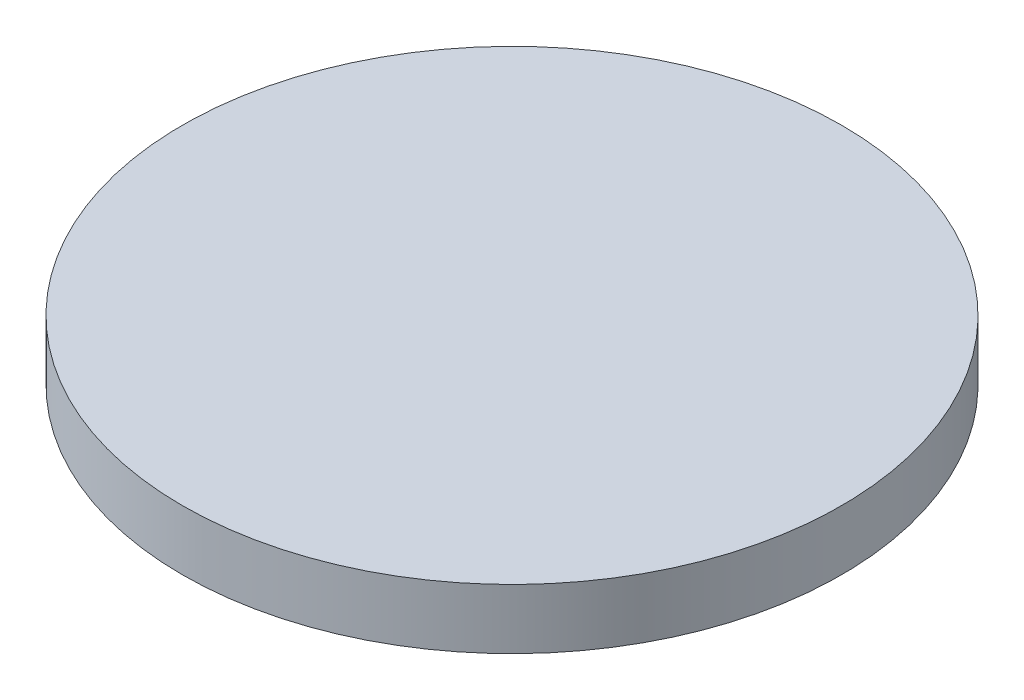
ISO-10303-21;
HEADER;
FILE_DESCRIPTION(('STEP AP214'),'2;1');
FILE_NAME('part.step','',(''),(''),'','','');
FILE_SCHEMA(('AUTOMOTIVE_DESIGN { 1 0 10303 214 1 1 1 1 }'));
ENDSEC;
DATA;
#1=APPLICATION_CONTEXT('core data for automotive mechanical design processes');
#2=APPLICATION_PROTOCOL_DEFINITION('international standard','automotive_design',2000,#1);
#3=PRODUCT_CONTEXT('',#1,'mechanical');
#4=PRODUCT('Part','Part','',(#3));
#5=PRODUCT_RELATED_PRODUCT_CATEGORY('part','',(#4));
#6=PRODUCT_DEFINITION_FORMATION('','',#4);
#7=PRODUCT_DEFINITION_CONTEXT('part definition',#1,'design');
#8=PRODUCT_DEFINITION('design','',#6,#7);
#9=PRODUCT_DEFINITION_SHAPE('','',#8);
#10=(LENGTH_UNIT() NAMED_UNIT(*) SI_UNIT(.MILLI.,.METRE.));
#11=(NAMED_UNIT(*) PLANE_ANGLE_UNIT() SI_UNIT($,.RADIAN.));
#12=(NAMED_UNIT(*) SI_UNIT($,.STERADIAN.) SOLID_ANGLE_UNIT());
#13=UNCERTAINTY_MEASURE_WITH_UNIT(LENGTH_MEASURE(1.E-05),#10,'distance_accuracy_value','');
#14=(GEOMETRIC_REPRESENTATION_CONTEXT(3) GLOBAL_UNCERTAINTY_ASSIGNED_CONTEXT((#13)) GLOBAL_UNIT_ASSIGNED_CONTEXT((#10,
#11,#12)) REPRESENTATION_CONTEXT('',''));
#15=CARTESIAN_POINT('',(0.,0.,0.));
#16=DIRECTION('',(0.,0.,1.));
#17=DIRECTION('',(1.,0.,0.));
#18=AXIS2_PLACEMENT_3D('',#15,#16,#17);
#19=CARTESIAN_POINT('',(0.,-0.5,0.));
#20=DIRECTION('',(0.,1.,0.));
#21=DIRECTION('',(0.,0.,1.));
#22=AXIS2_PLACEMENT_3D('',#19,#20,#21);
#23=CYLINDRICAL_SURFACE('',#22,2.75);
#24=CARTESIAN_POINT('',(0.,-0.5,0.));
#25=DIRECTION('',(0.,1.,0.));
#26=DIRECTION('',(0.,0.,1.));
#27=AXIS2_PLACEMENT_3D('',#24,#25,#26);
#28=CIRCLE('',#27,2.75);
#29=CARTESIAN_POINT('',(0.,-0.5,2.75));
#30=VERTEX_POINT('',#29);
#31=EDGE_CURVE('E10',#30,#30,#28,.T.);
#32=ORIENTED_EDGE('',*,*,#31,.T.);
#33=EDGE_LOOP('',(#32));
#34=FACE_BOUND('',#33,.T.);
#35=CARTESIAN_POINT('',(0.,0.,0.));
#36=DIRECTION('',(0.,1.,0.));
#37=DIRECTION('',(0.,0.,1.));
#38=AXIS2_PLACEMENT_3D('',#35,#36,#37);
#39=CIRCLE('',#38,2.75);
#40=CARTESIAN_POINT('',(0.,0.,2.75));
#41=VERTEX_POINT('',#40);
#42=EDGE_CURVE('E33',#41,#41,#39,.T.);
#43=ORIENTED_EDGE('',*,*,#42,.F.);
#44=EDGE_LOOP('',(#43));
#45=FACE_BOUND('',#44,.T.);
#46=ADVANCED_FACE('F30',(#34,#45),#23,.T.);
#47=CARTESIAN_POINT('',(0.,-0.5,0.));
#48=DIRECTION('',(0.,1.,0.));
#49=DIRECTION('',(0.,0.,1.));
#50=AXIS2_PLACEMENT_3D('',#47,#48,#49);
#51=PLANE('',#50);
#52=ORIENTED_EDGE('',*,*,#31,.F.);
#53=EDGE_LOOP('',(#52));
#54=FACE_BOUND('',#53,.T.);
#55=ADVANCED_FACE('F45',(#54),#51,.F.);
#56=CARTESIAN_POINT('',(0.,0.,0.));
#57=DIRECTION('',(0.,1.,0.));
#58=DIRECTION('',(0.,0.,1.));
#59=AXIS2_PLACEMENT_3D('',#56,#57,#58);
#60=PLANE('',#59);
#61=ORIENTED_EDGE('',*,*,#42,.T.);
#62=EDGE_LOOP('',(#61));
#63=FACE_BOUND('',#62,.T.);
#64=ADVANCED_FACE('F42',(#63),#60,.T.);
#65=CLOSED_SHELL('',(#46,#55,#64));
#66=MANIFOLD_SOLID_BREP('B2',#65);
#67=ADVANCED_BREP_SHAPE_REPRESENTATION('',(#18,#66),#14);
#68=SHAPE_DEFINITION_REPRESENTATION(#9,#67);
ENDSEC;
END-ISO-10303-21;
